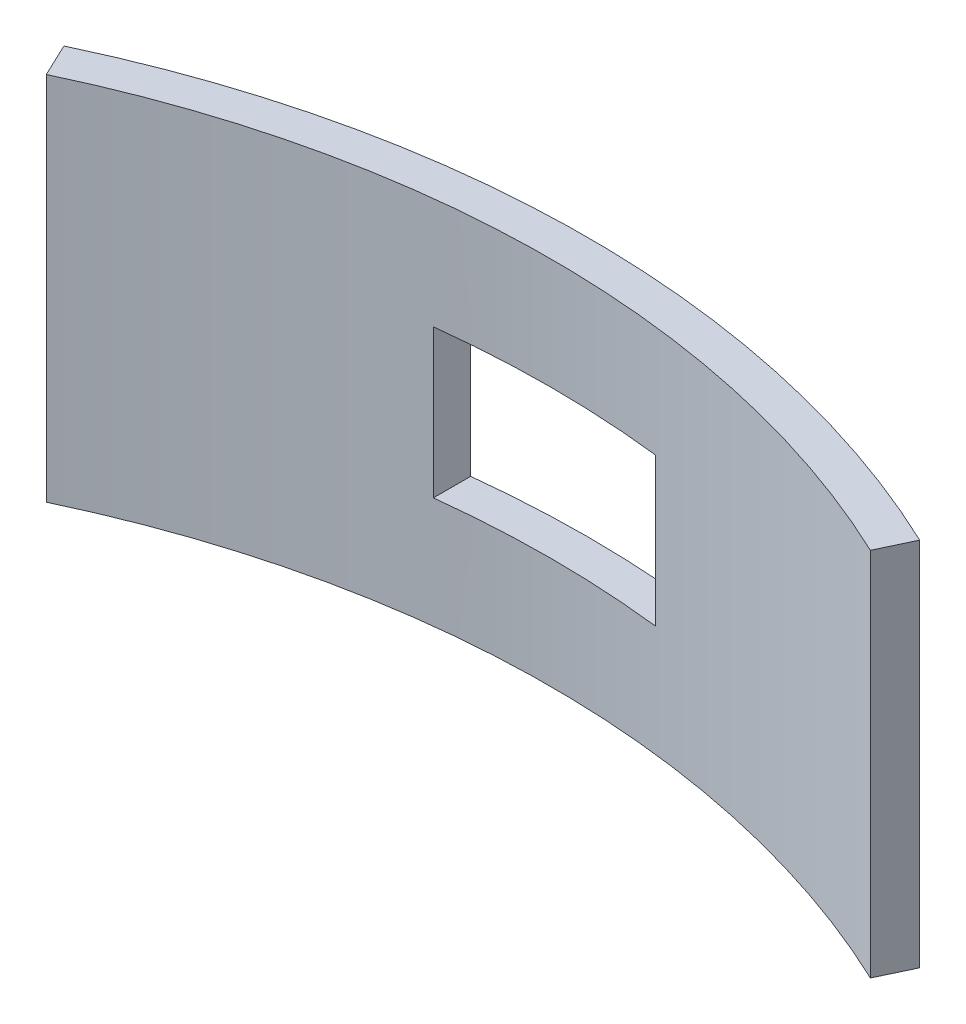
ISO-10303-21;
HEADER;
FILE_DESCRIPTION(('STEP AP214'),'2;1');
FILE_NAME('part.step','',(''),(''),'','','');
FILE_SCHEMA(('AUTOMOTIVE_DESIGN { 1 0 10303 214 1 1 1 1 }'));
ENDSEC;
DATA;
#1=APPLICATION_CONTEXT('core data for automotive mechanical design processes');
#2=APPLICATION_PROTOCOL_DEFINITION('international standard','automotive_design',2000,#1);
#3=PRODUCT_CONTEXT('',#1,'mechanical');
#4=PRODUCT('Part','Part','',(#3));
#5=PRODUCT_RELATED_PRODUCT_CATEGORY('part','',(#4));
#6=PRODUCT_DEFINITION_FORMATION('','',#4);
#7=PRODUCT_DEFINITION_CONTEXT('part definition',#1,'design');
#8=PRODUCT_DEFINITION('design','',#6,#7);
#9=PRODUCT_DEFINITION_SHAPE('','',#8);
#10=(LENGTH_UNIT() NAMED_UNIT(*) SI_UNIT(.MILLI.,.METRE.));
#11=(NAMED_UNIT(*) PLANE_ANGLE_UNIT() SI_UNIT($,.RADIAN.));
#12=(NAMED_UNIT(*) SI_UNIT($,.STERADIAN.) SOLID_ANGLE_UNIT());
#13=UNCERTAINTY_MEASURE_WITH_UNIT(LENGTH_MEASURE(1.E-05),#10,'distance_accuracy_value','');
#14=(GEOMETRIC_REPRESENTATION_CONTEXT(3) GLOBAL_UNCERTAINTY_ASSIGNED_CONTEXT((#13)) GLOBAL_UNIT_ASSIGNED_CONTEXT((#10,
#11,#12)) REPRESENTATION_CONTEXT('',''));
#15=CARTESIAN_POINT('',(0.,0.,0.));
#16=DIRECTION('',(0.,0.,1.));
#17=DIRECTION('',(1.,0.,0.));
#18=AXIS2_PLACEMENT_3D('',#15,#16,#17);
#19=CARTESIAN_POINT('',(0.,25.4,0.));
#20=DIRECTION('',(0.,-1.,0.));
#21=DIRECTION('',(0.,0.,-1.));
#22=AXIS2_PLACEMENT_3D('',#19,#20,#21);
#23=CYLINDRICAL_SURFACE('',#22,68.58);
#24=CARTESIAN_POINT('',(0.,7.62,0.));
#25=DIRECTION('',(0.,-1.,0.));
#26=DIRECTION('',(0.,0.,-1.));
#27=AXIS2_PLACEMENT_3D('',#24,#25,#26);
#28=CIRCLE('',#27,68.58);
#29=CARTESIAN_POINT('',(-7.62,7.62,-68.1553519541936));
#30=VERTEX_POINT('',#29);
#31=CARTESIAN_POINT('',(7.62,7.62,-68.1553519541936));
#32=VERTEX_POINT('',#31);
#33=EDGE_CURVE('E126',#30,#32,#28,.T.);
#34=ORIENTED_EDGE('',*,*,#33,.T.);
#35=DIRECTION('',(0.,-1.,0.));
#36=VECTOR('',#35,1.);
#37=CARTESIAN_POINT('',(7.62,25.4,-68.1553519541936));
#38=LINE('',#37,#36);
#39=CARTESIAN_POINT('',(7.62,17.78,-68.1553519541936));
#40=VERTEX_POINT('',#39);
#41=EDGE_CURVE('E119',#32,#40,#38,.F.);
#42=ORIENTED_EDGE('',*,*,#41,.T.);
#43=CARTESIAN_POINT('',(0.,17.78,0.));
#44=DIRECTION('',(0.,1.,0.));
#45=DIRECTION('',(0.,0.,1.));
#46=AXIS2_PLACEMENT_3D('',#43,#44,#45);
#47=CIRCLE('',#46,68.58);
#48=CARTESIAN_POINT('',(-7.62,17.78,-68.1553519541936));
#49=VERTEX_POINT('',#48);
#50=EDGE_CURVE('E107',#40,#49,#47,.T.);
#51=ORIENTED_EDGE('',*,*,#50,.T.);
#52=DIRECTION('',(0.,-1.,0.));
#53=VECTOR('',#52,1.);
#54=CARTESIAN_POINT('',(-7.62,25.4,-68.1553519541936));
#55=LINE('',#54,#53);
#56=EDGE_CURVE('E113',#49,#30,#55,.T.);
#57=ORIENTED_EDGE('',*,*,#56,.T.);
#58=EDGE_LOOP('',(#34,#42,#51,#57));
#59=FACE_BOUND('',#58,.T.);
#60=CARTESIAN_POINT('',(0.,0.,0.));
#61=DIRECTION('',(0.,1.,0.));
#62=DIRECTION('',(0.,0.,-1.));
#63=AXIS2_PLACEMENT_3D('',#60,#61,#62);
#64=CIRCLE('',#63,68.58);
#65=CARTESIAN_POINT('',(29.3424745525973,0.,-61.9857692307693));
#66=VERTEX_POINT('',#65);
#67=CARTESIAN_POINT('',(-29.3424745525973,0.,-61.9857692307693));
#68=VERTEX_POINT('',#67);
#69=EDGE_CURVE('E128',#66,#68,#64,.T.);
#70=ORIENTED_EDGE('',*,*,#69,.T.);
#71=DIRECTION('',(0.,-1.,0.));
#72=VECTOR('',#71,1.);
#73=CARTESIAN_POINT('',(-29.3424745525973,25.4,-61.9857692307693));
#74=LINE('',#73,#72);
#75=CARTESIAN_POINT('',(-29.3424745525973,25.4,-61.9857692307693));
#76=VERTEX_POINT('',#75);
#77=EDGE_CURVE('E171',#76,#68,#74,.T.);
#78=ORIENTED_EDGE('',*,*,#77,.F.);
#79=CARTESIAN_POINT('',(0.,25.4,0.));
#80=DIRECTION('',(0.,1.,0.));
#81=DIRECTION('',(0.,0.,-1.));
#82=AXIS2_PLACEMENT_3D('',#79,#80,#81);
#83=CIRCLE('',#82,68.58);
#84=CARTESIAN_POINT('',(29.3424745525973,25.4,-61.9857692307693));
#85=VERTEX_POINT('',#84);
#86=EDGE_CURVE('E138',#85,#76,#83,.T.);
#87=ORIENTED_EDGE('',*,*,#86,.F.);
#88=DIRECTION('',(0.,-1.,0.));
#89=VECTOR('',#88,1.);
#90=CARTESIAN_POINT('',(29.3424745525973,25.4,-61.9857692307693));
#91=LINE('',#90,#89);
#92=EDGE_CURVE('E151',#85,#66,#91,.T.);
#93=ORIENTED_EDGE('',*,*,#92,.T.);
#94=EDGE_LOOP('',(#70,#78,#87,#93));
#95=FACE_BOUND('',#94,.T.);
#96=ADVANCED_FACE('F45',(#59,#95),#23,.T.);
#97=CARTESIAN_POINT('',(-29.3424745525973,25.4,-61.9857692307693));
#98=DIRECTION('',(0.903846153846156,0.,-0.427857605024746));
#99=DIRECTION('',(-0.427857605024746,0.,-0.903846153846156));
#100=AXIS2_PLACEMENT_3D('',#97,#98,#99);
#101=PLANE('',#100);
#102=DIRECTION('',(0.427857605024746,0.,0.903846153846156));
#103=VECTOR('',#102,1.);
#104=CARTESIAN_POINT('',(-29.3424745525973,0.,-61.9857692307693));
#105=LINE('',#104,#103);
#106=CARTESIAN_POINT('',(-28.2557162358345,0.,-59.69));
#107=VERTEX_POINT('',#106);
#108=EDGE_CURVE('E133',#68,#107,#105,.T.);
#109=ORIENTED_EDGE('',*,*,#108,.T.);
#110=DIRECTION('',(0.,-1.,0.));
#111=VECTOR('',#110,1.);
#112=CARTESIAN_POINT('',(-28.2557162358345,25.4,-59.69));
#113=LINE('',#112,#111);
#114=CARTESIAN_POINT('',(-28.2557162358345,25.4,-59.69));
#115=VERTEX_POINT('',#114);
#116=EDGE_CURVE('E167',#115,#107,#113,.T.);
#117=ORIENTED_EDGE('',*,*,#116,.F.);
#118=DIRECTION('',(0.427857605024746,0.,0.903846153846156));
#119=VECTOR('',#118,1.);
#120=CARTESIAN_POINT('',(-29.3424745525973,25.4,-61.9857692307693));
#121=LINE('',#120,#119);
#122=EDGE_CURVE('E142',#76,#115,#121,.T.);
#123=ORIENTED_EDGE('',*,*,#122,.F.);
#124=ORIENTED_EDGE('',*,*,#77,.T.);
#125=EDGE_LOOP('',(#109,#117,#123,#124));
#126=FACE_BOUND('',#125,.T.);
#127=ADVANCED_FACE('F209',(#126),#101,.F.);
#128=CARTESIAN_POINT('',(0.,25.4,0.));
#129=DIRECTION('',(0.,-1.,0.));
#130=DIRECTION('',(0.,0.,-1.));
#131=AXIS2_PLACEMENT_3D('',#128,#129,#130);
#132=CYLINDRICAL_SURFACE('',#131,66.04);
#133=CARTESIAN_POINT('',(0.,17.78,0.));
#134=DIRECTION('',(0.,1.,0.));
#135=DIRECTION('',(0.,0.,1.));
#136=AXIS2_PLACEMENT_3D('',#133,#134,#135);
#137=CIRCLE('',#136,66.04);
#138=CARTESIAN_POINT('',(-7.62,17.78,-65.5989115763364));
#139=VERTEX_POINT('',#138);
#140=CARTESIAN_POINT('',(7.62,17.78,-65.5989115763364));
#141=VERTEX_POINT('',#140);
#142=EDGE_CURVE('E175',#139,#141,#137,.F.);
#143=ORIENTED_EDGE('',*,*,#142,.T.);
#144=DIRECTION('',(0.,-1.,0.));
#145=VECTOR('',#144,1.);
#146=CARTESIAN_POINT('',(7.62,25.4,-65.5989115763364));
#147=LINE('',#146,#145);
#148=CARTESIAN_POINT('',(7.62,7.62,-65.5989115763364));
#149=VERTEX_POINT('',#148);
#150=EDGE_CURVE('E11',#141,#149,#147,.T.);
#151=ORIENTED_EDGE('',*,*,#150,.T.);
#152=CARTESIAN_POINT('',(0.,7.62,0.));
#153=DIRECTION('',(0.,-1.,0.));
#154=DIRECTION('',(0.,0.,-1.));
#155=AXIS2_PLACEMENT_3D('',#152,#153,#154);
#156=CIRCLE('',#155,66.04);
#157=CARTESIAN_POINT('',(-7.62,7.62,-65.5989115763364));
#158=VERTEX_POINT('',#157);
#159=EDGE_CURVE('E53',#149,#158,#156,.F.);
#160=ORIENTED_EDGE('',*,*,#159,.T.);
#161=DIRECTION('',(0.,-1.,0.));
#162=VECTOR('',#161,1.);
#163=CARTESIAN_POINT('',(-7.62,25.4,-65.5989115763364));
#164=LINE('',#163,#162);
#165=EDGE_CURVE('E178',#158,#139,#164,.F.);
#166=ORIENTED_EDGE('',*,*,#165,.T.);
#167=EDGE_LOOP('',(#143,#151,#160,#166));
#168=FACE_BOUND('',#167,.T.);
#169=CARTESIAN_POINT('',(0.,0.,0.));
#170=DIRECTION('',(0.,-1.,0.));
#171=DIRECTION('',(0.,0.,-1.));
#172=AXIS2_PLACEMENT_3D('',#169,#170,#171);
#173=CIRCLE('',#172,66.04);
#174=CARTESIAN_POINT('',(28.2557162358345,0.,-59.69));
#175=VERTEX_POINT('',#174);
#176=EDGE_CURVE('E155',#107,#175,#173,.T.);
#177=ORIENTED_EDGE('',*,*,#176,.T.);
#178=DIRECTION('',(0.,-1.,0.));
#179=VECTOR('',#178,1.);
#180=CARTESIAN_POINT('',(28.2557162358345,25.4,-59.69));
#181=LINE('',#180,#179);
#182=CARTESIAN_POINT('',(28.2557162358345,25.4,-59.69));
#183=VERTEX_POINT('',#182);
#184=EDGE_CURVE('E163',#183,#175,#181,.T.);
#185=ORIENTED_EDGE('',*,*,#184,.F.);
#186=CARTESIAN_POINT('',(0.,25.4,0.));
#187=DIRECTION('',(0.,-1.,0.));
#188=DIRECTION('',(0.,0.,-1.));
#189=AXIS2_PLACEMENT_3D('',#186,#187,#188);
#190=CIRCLE('',#189,66.04);
#191=EDGE_CURVE('E146',#115,#183,#190,.T.);
#192=ORIENTED_EDGE('',*,*,#191,.F.);
#193=ORIENTED_EDGE('',*,*,#116,.T.);
#194=EDGE_LOOP('',(#177,#185,#192,#193));
#195=FACE_BOUND('',#194,.T.);
#196=ADVANCED_FACE('F184',(#168,#195),#132,.F.);
#197=CARTESIAN_POINT('',(28.2557162358345,25.4,-59.69));
#198=DIRECTION('',(-0.903846153846154,0.,-0.42785760502475));
#199=DIRECTION('',(-0.42785760502475,0.,0.903846153846154));
#200=AXIS2_PLACEMENT_3D('',#197,#198,#199);
#201=PLANE('',#200);
#202=DIRECTION('',(0.42785760502475,0.,-0.903846153846154));
#203=VECTOR('',#202,1.);
#204=CARTESIAN_POINT('',(28.2557162358345,0.,-59.69));
#205=LINE('',#204,#203);
#206=EDGE_CURVE('E143',#175,#66,#205,.T.);
#207=ORIENTED_EDGE('',*,*,#206,.T.);
#208=ORIENTED_EDGE('',*,*,#92,.F.);
#209=DIRECTION('',(0.42785760502475,0.,-0.903846153846154));
#210=VECTOR('',#209,1.);
#211=CARTESIAN_POINT('',(28.2557162358345,25.4,-59.69));
#212=LINE('',#211,#210);
#213=EDGE_CURVE('E149',#183,#85,#212,.T.);
#214=ORIENTED_EDGE('',*,*,#213,.F.);
#215=ORIENTED_EDGE('',*,*,#184,.T.);
#216=EDGE_LOOP('',(#207,#208,#214,#215));
#217=FACE_BOUND('',#216,.T.);
#218=ADVANCED_FACE('F219',(#217),#201,.F.);
#219=CARTESIAN_POINT('',(0.,25.4,0.));
#220=DIRECTION('',(0.,-1.,0.));
#221=DIRECTION('',(0.,0.,-1.));
#222=AXIS2_PLACEMENT_3D('',#219,#220,#221);
#223=PLANE('',#222);
#224=ORIENTED_EDGE('',*,*,#86,.T.);
#225=ORIENTED_EDGE('',*,*,#122,.T.);
#226=ORIENTED_EDGE('',*,*,#191,.T.);
#227=ORIENTED_EDGE('',*,*,#213,.T.);
#228=EDGE_LOOP('',(#224,#225,#226,#227));
#229=FACE_BOUND('',#228,.T.);
#230=ADVANCED_FACE('F223',(#229),#223,.F.);
#231=CARTESIAN_POINT('',(0.,0.,0.));
#232=DIRECTION('',(0.,-1.,0.));
#233=DIRECTION('',(0.,0.,-1.));
#234=AXIS2_PLACEMENT_3D('',#231,#232,#233);
#235=PLANE('',#234);
#236=ORIENTED_EDGE('',*,*,#69,.F.);
#237=ORIENTED_EDGE('',*,*,#206,.F.);
#238=ORIENTED_EDGE('',*,*,#176,.F.);
#239=ORIENTED_EDGE('',*,*,#108,.F.);
#240=EDGE_LOOP('',(#236,#237,#238,#239));
#241=FACE_BOUND('',#240,.T.);
#242=ADVANCED_FACE('F225',(#241),#235,.T.);
#243=CARTESIAN_POINT('',(7.62,17.78,-144.272));
#244=DIRECTION('',(1.,0.,0.));
#245=DIRECTION('',(0.,1.,0.));
#246=AXIS2_PLACEMENT_3D('',#243,#244,#245);
#247=PLANE('',#246);
#248=DIRECTION('',(0.,0.,1.));
#249=VECTOR('',#248,1.);
#250=CARTESIAN_POINT('',(7.62,7.62,-144.272));
#251=LINE('',#250,#249);
#252=EDGE_CURVE('E114',#32,#149,#251,.T.);
#253=ORIENTED_EDGE('',*,*,#252,.T.);
#254=ORIENTED_EDGE('',*,*,#150,.F.);
#255=DIRECTION('',(0.,0.,1.));
#256=VECTOR('',#255,1.);
#257=CARTESIAN_POINT('',(7.62,17.78,-144.272));
#258=LINE('',#257,#256);
#259=EDGE_CURVE('E65',#40,#141,#258,.T.);
#260=ORIENTED_EDGE('',*,*,#259,.F.);
#261=ORIENTED_EDGE('',*,*,#41,.F.);
#262=EDGE_LOOP('',(#253,#254,#260,#261));
#263=FACE_BOUND('',#262,.T.);
#264=ADVANCED_FACE('F118',(#263),#247,.F.);
#265=CARTESIAN_POINT('',(-7.62,7.62,-144.272));
#266=DIRECTION('',(0.,-1.,0.));
#267=DIRECTION('',(0.,0.,-1.));
#268=AXIS2_PLACEMENT_3D('',#265,#266,#267);
#269=PLANE('',#268);
#270=DIRECTION('',(0.,0.,1.));
#271=VECTOR('',#270,1.);
#272=CARTESIAN_POINT('',(-7.62,7.62,-144.272));
#273=LINE('',#272,#271);
#274=EDGE_CURVE('E190',#30,#158,#273,.T.);
#275=ORIENTED_EDGE('',*,*,#274,.T.);
#276=ORIENTED_EDGE('',*,*,#159,.F.);
#277=ORIENTED_EDGE('',*,*,#252,.F.);
#278=ORIENTED_EDGE('',*,*,#33,.F.);
#279=EDGE_LOOP('',(#275,#276,#277,#278));
#280=FACE_BOUND('',#279,.T.);
#281=ADVANCED_FACE('F188',(#280),#269,.F.);
#282=CARTESIAN_POINT('',(-7.62,17.78,-144.272));
#283=DIRECTION('',(-1.,0.,0.));
#284=DIRECTION('',(0.,-1.,0.));
#285=AXIS2_PLACEMENT_3D('',#282,#283,#284);
#286=PLANE('',#285);
#287=DIRECTION('',(0.,0.,1.));
#288=VECTOR('',#287,1.);
#289=CARTESIAN_POINT('',(-7.62,17.78,-144.272));
#290=LINE('',#289,#288);
#291=EDGE_CURVE('E60',#49,#139,#290,.T.);
#292=ORIENTED_EDGE('',*,*,#291,.T.);
#293=ORIENTED_EDGE('',*,*,#165,.F.);
#294=ORIENTED_EDGE('',*,*,#274,.F.);
#295=ORIENTED_EDGE('',*,*,#56,.F.);
#296=EDGE_LOOP('',(#292,#293,#294,#295));
#297=FACE_BOUND('',#296,.T.);
#298=ADVANCED_FACE('F199',(#297),#286,.F.);
#299=CARTESIAN_POINT('',(-7.62,17.78,-144.272));
#300=DIRECTION('',(0.,1.,0.));
#301=DIRECTION('',(0.,0.,1.));
#302=AXIS2_PLACEMENT_3D('',#299,#300,#301);
#303=PLANE('',#302);
#304=ORIENTED_EDGE('',*,*,#259,.T.);
#305=ORIENTED_EDGE('',*,*,#142,.F.);
#306=ORIENTED_EDGE('',*,*,#291,.F.);
#307=ORIENTED_EDGE('',*,*,#50,.F.);
#308=EDGE_LOOP('',(#304,#305,#306,#307));
#309=FACE_BOUND('',#308,.T.);
#310=ADVANCED_FACE('F108',(#309),#303,.F.);
#311=CLOSED_SHELL('',(#96,#127,#196,#218,#230,#242,#264,#281,#298,#310));
#312=MANIFOLD_SOLID_BREP('B2',#311);
#313=ADVANCED_BREP_SHAPE_REPRESENTATION('',(#18,#312),#14);
#314=SHAPE_DEFINITION_REPRESENTATION(#9,#313);
ENDSEC;
END-ISO-10303-21;
